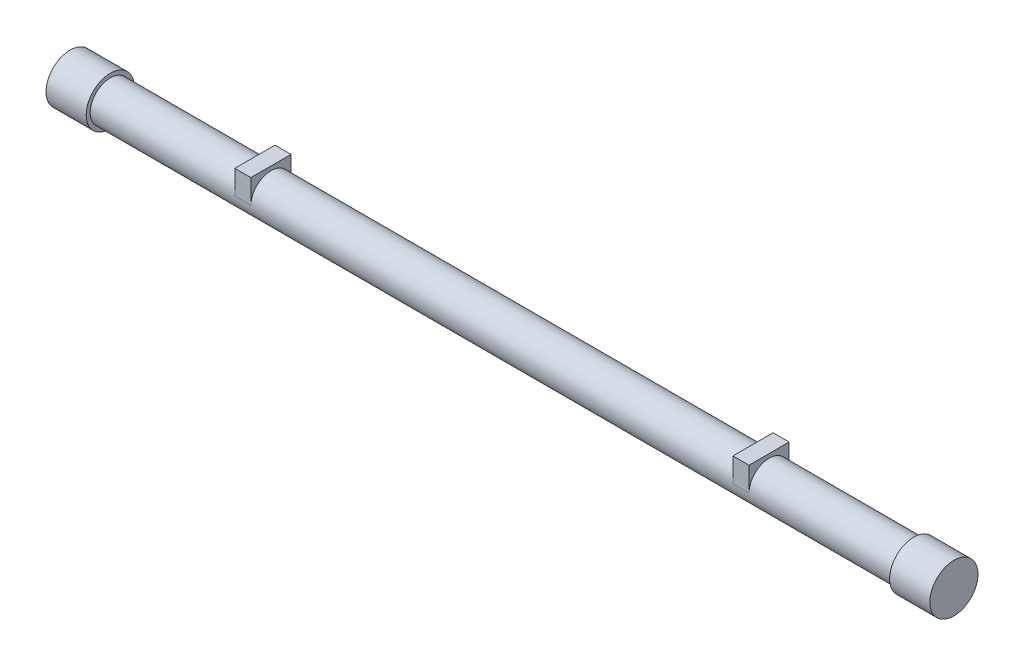
ISO-10303-21;
HEADER;
FILE_DESCRIPTION(('STEP AP214'),'2;1');
FILE_NAME('part.step','',(''),(''),'','','');
FILE_SCHEMA(('AUTOMOTIVE_DESIGN { 1 0 10303 214 1 1 1 1 }'));
ENDSEC;
DATA;
#1=APPLICATION_CONTEXT('core data for automotive mechanical design processes');
#2=APPLICATION_PROTOCOL_DEFINITION('international standard','automotive_design',2000,#1);
#3=PRODUCT_CONTEXT('',#1,'mechanical');
#4=PRODUCT('Part','Part','',(#3));
#5=PRODUCT_RELATED_PRODUCT_CATEGORY('part','',(#4));
#6=PRODUCT_DEFINITION_FORMATION('','',#4);
#7=PRODUCT_DEFINITION_CONTEXT('part definition',#1,'design');
#8=PRODUCT_DEFINITION('design','',#6,#7);
#9=PRODUCT_DEFINITION_SHAPE('','',#8);
#10=(LENGTH_UNIT() NAMED_UNIT(*) SI_UNIT(.MILLI.,.METRE.));
#11=(NAMED_UNIT(*) PLANE_ANGLE_UNIT() SI_UNIT($,.RADIAN.));
#12=(NAMED_UNIT(*) SI_UNIT($,.STERADIAN.) SOLID_ANGLE_UNIT());
#13=UNCERTAINTY_MEASURE_WITH_UNIT(LENGTH_MEASURE(1.E-05),#10,'distance_accuracy_value','');
#14=(GEOMETRIC_REPRESENTATION_CONTEXT(3) GLOBAL_UNCERTAINTY_ASSIGNED_CONTEXT((#13)) GLOBAL_UNIT_ASSIGNED_CONTEXT((#10,
#11,#12)) REPRESENTATION_CONTEXT('',''));
#15=CARTESIAN_POINT('',(0.,0.,0.));
#16=DIRECTION('',(0.,0.,1.));
#17=DIRECTION('',(1.,0.,0.));
#18=AXIS2_PLACEMENT_3D('',#15,#16,#17);
#19=CARTESIAN_POINT('',(550.,0.,0.));
#20=DIRECTION('',(-1.,0.,0.));
#21=DIRECTION('',(0.,0.,1.));
#22=AXIS2_PLACEMENT_3D('',#19,#20,#21);
#23=CYLINDRICAL_SURFACE('',#22,12.5);
#24=CARTESIAN_POINT('',(435.,0.,0.));
#25=DIRECTION('',(-1.,0.,0.));
#26=DIRECTION('',(0.,0.,1.));
#27=AXIS2_PLACEMENT_3D('',#24,#25,#26);
#28=CIRCLE('',#27,12.5);
#29=CARTESIAN_POINT('',(435.,0.,12.5));
#30=VERTEX_POINT('',#29);
#31=CARTESIAN_POINT('',(435.,0.,-12.5));
#32=VERTEX_POINT('',#31);
#33=EDGE_CURVE('E171',#30,#32,#28,.T.);
#34=ORIENTED_EDGE('',*,*,#33,.F.);
#35=DIRECTION('',(1.,0.,0.));
#36=VECTOR('',#35,1.);
#37=CARTESIAN_POINT('',(435.,0.,12.5));
#38=LINE('',#37,#36);
#39=CARTESIAN_POINT('',(425.,0.,12.5));
#40=VERTEX_POINT('',#39);
#41=EDGE_CURVE('E142',#40,#30,#38,.T.);
#42=ORIENTED_EDGE('',*,*,#41,.F.);
#43=CARTESIAN_POINT('',(425.,0.,0.));
#44=DIRECTION('',(1.,0.,0.));
#45=DIRECTION('',(0.,0.,-1.));
#46=AXIS2_PLACEMENT_3D('',#43,#44,#45);
#47=CIRCLE('',#46,12.5);
#48=CARTESIAN_POINT('',(425.,0.,-12.5));
#49=VERTEX_POINT('',#48);
#50=EDGE_CURVE('E169',#49,#40,#47,.T.);
#51=ORIENTED_EDGE('',*,*,#50,.F.);
#52=DIRECTION('',(-1.,0.,0.));
#53=VECTOR('',#52,1.);
#54=CARTESIAN_POINT('',(435.,0.,-12.5));
#55=LINE('',#54,#53);
#56=EDGE_CURVE('E144',#32,#49,#55,.T.);
#57=ORIENTED_EDGE('',*,*,#56,.F.);
#58=EDGE_LOOP('',(#34,#42,#51,#57));
#59=FACE_BOUND('',#58,.T.);
#60=CARTESIAN_POINT('',(525.,0.,0.));
#61=DIRECTION('',(1.,0.,0.));
#62=DIRECTION('',(0.,0.,-1.));
#63=AXIS2_PLACEMENT_3D('',#60,#61,#62);
#64=CIRCLE('',#63,12.5);
#65=CARTESIAN_POINT('',(525.,0.,-12.5));
#66=VERTEX_POINT('',#65);
#67=EDGE_CURVE('E161',#66,#66,#64,.T.);
#68=ORIENTED_EDGE('',*,*,#67,.F.);
#69=EDGE_LOOP('',(#68));
#70=FACE_BOUND('',#69,.T.);
#71=CARTESIAN_POINT('',(25.,0.,0.));
#72=DIRECTION('',(-1.,0.,0.));
#73=DIRECTION('',(0.,0.,1.));
#74=AXIS2_PLACEMENT_3D('',#71,#72,#73);
#75=CIRCLE('',#74,12.5);
#76=CARTESIAN_POINT('',(25.,0.,12.5));
#77=VERTEX_POINT('',#76);
#78=EDGE_CURVE('E166',#77,#77,#75,.T.);
#79=ORIENTED_EDGE('',*,*,#78,.F.);
#80=EDGE_LOOP('',(#79));
#81=FACE_BOUND('',#80,.T.);
#82=CARTESIAN_POINT('',(115.,0.,0.));
#83=DIRECTION('',(1.,0.,0.));
#84=DIRECTION('',(0.,0.,-1.));
#85=AXIS2_PLACEMENT_3D('',#82,#83,#84);
#86=CIRCLE('',#85,12.5);
#87=CARTESIAN_POINT('',(115.,0.,-12.5));
#88=VERTEX_POINT('',#87);
#89=CARTESIAN_POINT('',(115.,0.,12.5));
#90=VERTEX_POINT('',#89);
#91=EDGE_CURVE('E11',#88,#90,#86,.T.);
#92=ORIENTED_EDGE('',*,*,#91,.F.);
#93=DIRECTION('',(-1.,0.,0.));
#94=VECTOR('',#93,1.);
#95=CARTESIAN_POINT('',(115.,0.,-12.5));
#96=LINE('',#95,#94);
#97=CARTESIAN_POINT('',(125.,0.,-12.5));
#98=VERTEX_POINT('',#97);
#99=EDGE_CURVE('E55',#98,#88,#96,.T.);
#100=ORIENTED_EDGE('',*,*,#99,.F.);
#101=CARTESIAN_POINT('',(125.,0.,0.));
#102=DIRECTION('',(-1.,0.,0.));
#103=DIRECTION('',(0.,0.,1.));
#104=AXIS2_PLACEMENT_3D('',#101,#102,#103);
#105=CIRCLE('',#104,12.5);
#106=CARTESIAN_POINT('',(125.,0.,12.5));
#107=VERTEX_POINT('',#106);
#108=EDGE_CURVE('E46',#107,#98,#105,.T.);
#109=ORIENTED_EDGE('',*,*,#108,.F.);
#110=DIRECTION('',(1.,0.,0.));
#111=VECTOR('',#110,1.);
#112=CARTESIAN_POINT('',(115.,0.,12.5));
#113=LINE('',#112,#111);
#114=EDGE_CURVE('E147',#90,#107,#113,.T.);
#115=ORIENTED_EDGE('',*,*,#114,.F.);
#116=EDGE_LOOP('',(#92,#100,#109,#115));
#117=FACE_BOUND('',#116,.T.);
#118=ADVANCED_FACE('F39',(#59,#70,#81,#117),#23,.T.);
#119=CARTESIAN_POINT('',(525.,0.,0.));
#120=DIRECTION('',(1.,0.,0.));
#121=DIRECTION('',(0.,0.,-1.));
#122=AXIS2_PLACEMENT_3D('',#119,#120,#121);
#123=CYLINDRICAL_SURFACE('',#122,15.);
#124=CARTESIAN_POINT('',(525.,0.,0.));
#125=DIRECTION('',(1.,0.,0.));
#126=DIRECTION('',(0.,0.,-1.));
#127=AXIS2_PLACEMENT_3D('',#124,#125,#126);
#128=CIRCLE('',#127,15.);
#129=CARTESIAN_POINT('',(525.,0.,-15.));
#130=VERTEX_POINT('',#129);
#131=EDGE_CURVE('E158',#130,#130,#128,.T.);
#132=ORIENTED_EDGE('',*,*,#131,.T.);
#133=EDGE_LOOP('',(#132));
#134=FACE_BOUND('',#133,.T.);
#135=CARTESIAN_POINT('',(550.,0.,0.));
#136=DIRECTION('',(1.,0.,0.));
#137=DIRECTION('',(0.,0.,-1.));
#138=AXIS2_PLACEMENT_3D('',#135,#136,#137);
#139=CIRCLE('',#138,15.);
#140=CARTESIAN_POINT('',(550.,0.,-15.));
#141=VERTEX_POINT('',#140);
#142=EDGE_CURVE('E156',#141,#141,#139,.T.);
#143=ORIENTED_EDGE('',*,*,#142,.F.);
#144=EDGE_LOOP('',(#143));
#145=FACE_BOUND('',#144,.T.);
#146=ADVANCED_FACE('F186',(#134,#145),#123,.T.);
#147=CARTESIAN_POINT('',(525.,0.,0.));
#148=DIRECTION('',(1.,0.,0.));
#149=DIRECTION('',(0.,0.,-1.));
#150=AXIS2_PLACEMENT_3D('',#147,#148,#149);
#151=PLANE('',#150);
#152=ORIENTED_EDGE('',*,*,#67,.T.);
#153=EDGE_LOOP('',(#152));
#154=FACE_BOUND('',#153,.T.);
#155=ORIENTED_EDGE('',*,*,#131,.F.);
#156=EDGE_LOOP('',(#155));
#157=FACE_BOUND('',#156,.T.);
#158=ADVANCED_FACE('F193',(#154,#157),#151,.F.);
#159=CARTESIAN_POINT('',(550.,0.,0.));
#160=DIRECTION('',(1.,0.,0.));
#161=DIRECTION('',(0.,0.,-1.));
#162=AXIS2_PLACEMENT_3D('',#159,#160,#161);
#163=PLANE('',#162);
#164=ORIENTED_EDGE('',*,*,#142,.T.);
#165=EDGE_LOOP('',(#164));
#166=FACE_BOUND('',#165,.T.);
#167=ADVANCED_FACE('F214',(#166),#163,.T.);
#168=CARTESIAN_POINT('',(25.,0.,0.));
#169=DIRECTION('',(-1.,0.,0.));
#170=DIRECTION('',(0.,0.,1.));
#171=AXIS2_PLACEMENT_3D('',#168,#169,#170);
#172=CYLINDRICAL_SURFACE('',#171,15.);
#173=CARTESIAN_POINT('',(25.,0.,0.));
#174=DIRECTION('',(-1.,0.,0.));
#175=DIRECTION('',(0.,0.,1.));
#176=AXIS2_PLACEMENT_3D('',#173,#174,#175);
#177=CIRCLE('',#176,15.);
#178=CARTESIAN_POINT('',(25.,0.,15.));
#179=VERTEX_POINT('',#178);
#180=EDGE_CURVE('E124',#179,#179,#177,.T.);
#181=ORIENTED_EDGE('',*,*,#180,.T.);
#182=EDGE_LOOP('',(#181));
#183=FACE_BOUND('',#182,.T.);
#184=CARTESIAN_POINT('',(0.,0.,0.));
#185=DIRECTION('',(-1.,0.,0.));
#186=DIRECTION('',(0.,0.,1.));
#187=AXIS2_PLACEMENT_3D('',#184,#185,#186);
#188=CIRCLE('',#187,15.);
#189=CARTESIAN_POINT('',(0.,0.,15.));
#190=VERTEX_POINT('',#189);
#191=EDGE_CURVE('E121',#190,#190,#188,.T.);
#192=ORIENTED_EDGE('',*,*,#191,.F.);
#193=EDGE_LOOP('',(#192));
#194=FACE_BOUND('',#193,.T.);
#195=ADVANCED_FACE('F208',(#183,#194),#172,.T.);
#196=CARTESIAN_POINT('',(25.,0.,0.));
#197=DIRECTION('',(-1.,0.,0.));
#198=DIRECTION('',(0.,0.,1.));
#199=AXIS2_PLACEMENT_3D('',#196,#197,#198);
#200=PLANE('',#199);
#201=ORIENTED_EDGE('',*,*,#78,.T.);
#202=EDGE_LOOP('',(#201));
#203=FACE_BOUND('',#202,.T.);
#204=ORIENTED_EDGE('',*,*,#180,.F.);
#205=EDGE_LOOP('',(#204));
#206=FACE_BOUND('',#205,.T.);
#207=ADVANCED_FACE('F204',(#203,#206),#200,.F.);
#208=CARTESIAN_POINT('',(0.,0.,0.));
#209=DIRECTION('',(1.,0.,0.));
#210=DIRECTION('',(0.,0.,-1.));
#211=AXIS2_PLACEMENT_3D('',#208,#209,#210);
#212=PLANE('',#211);
#213=ORIENTED_EDGE('',*,*,#191,.T.);
#214=EDGE_LOOP('',(#213));
#215=FACE_BOUND('',#214,.T.);
#216=ADVANCED_FACE('F207',(#215),#212,.F.);
#217=CARTESIAN_POINT('',(435.,15.,-12.5));
#218=DIRECTION('',(-1.,0.,0.));
#219=DIRECTION('',(0.,0.,1.));
#220=AXIS2_PLACEMENT_3D('',#217,#218,#219);
#221=PLANE('',#220);
#222=DIRECTION('',(0.,-1.,0.));
#223=VECTOR('',#222,1.);
#224=CARTESIAN_POINT('',(435.,15.,12.5));
#225=LINE('',#224,#223);
#226=CARTESIAN_POINT('',(435.,15.,12.5));
#227=VERTEX_POINT('',#226);
#228=EDGE_CURVE('E138',#227,#30,#225,.T.);
#229=ORIENTED_EDGE('',*,*,#228,.T.);
#230=ORIENTED_EDGE('',*,*,#33,.T.);
#231=DIRECTION('',(0.,-1.,0.));
#232=VECTOR('',#231,1.);
#233=CARTESIAN_POINT('',(435.,15.,-12.5));
#234=LINE('',#233,#232);
#235=CARTESIAN_POINT('',(435.,15.,-12.5));
#236=VERTEX_POINT('',#235);
#237=EDGE_CURVE('E130',#236,#32,#234,.T.);
#238=ORIENTED_EDGE('',*,*,#237,.F.);
#239=DIRECTION('',(0.,0.,-1.));
#240=VECTOR('',#239,1.);
#241=CARTESIAN_POINT('',(435.,15.,-12.5));
#242=LINE('',#241,#240);
#243=EDGE_CURVE('E145',#227,#236,#242,.T.);
#244=ORIENTED_EDGE('',*,*,#243,.F.);
#245=EDGE_LOOP('',(#229,#230,#238,#244));
#246=FACE_BOUND('',#245,.T.);
#247=ADVANCED_FACE('F218',(#246),#221,.F.);
#248=CARTESIAN_POINT('',(435.,15.,-12.5));
#249=DIRECTION('',(0.,0.,1.));
#250=DIRECTION('',(1.,0.,0.));
#251=AXIS2_PLACEMENT_3D('',#248,#249,#250);
#252=PLANE('',#251);
#253=ORIENTED_EDGE('',*,*,#56,.T.);
#254=DIRECTION('',(0.,-1.,0.));
#255=VECTOR('',#254,1.);
#256=CARTESIAN_POINT('',(425.,15.,-12.5));
#257=LINE('',#256,#255);
#258=CARTESIAN_POINT('',(425.,15.,-12.5));
#259=VERTEX_POINT('',#258);
#260=EDGE_CURVE('E132',#259,#49,#257,.T.);
#261=ORIENTED_EDGE('',*,*,#260,.F.);
#262=DIRECTION('',(-1.,0.,0.));
#263=VECTOR('',#262,1.);
#264=CARTESIAN_POINT('',(435.,15.,-12.5));
#265=LINE('',#264,#263);
#266=EDGE_CURVE('E151',#236,#259,#265,.T.);
#267=ORIENTED_EDGE('',*,*,#266,.F.);
#268=ORIENTED_EDGE('',*,*,#237,.T.);
#269=EDGE_LOOP('',(#253,#261,#267,#268));
#270=FACE_BOUND('',#269,.T.);
#271=ADVANCED_FACE('F221',(#270),#252,.F.);
#272=CARTESIAN_POINT('',(425.,15.,-12.5));
#273=DIRECTION('',(1.,0.,0.));
#274=DIRECTION('',(0.,0.,-1.));
#275=AXIS2_PLACEMENT_3D('',#272,#273,#274);
#276=PLANE('',#275);
#277=ORIENTED_EDGE('',*,*,#260,.T.);
#278=ORIENTED_EDGE('',*,*,#50,.T.);
#279=DIRECTION('',(0.,-1.,0.));
#280=VECTOR('',#279,1.);
#281=CARTESIAN_POINT('',(425.,15.,12.5));
#282=LINE('',#281,#280);
#283=CARTESIAN_POINT('',(425.,15.,12.5));
#284=VERTEX_POINT('',#283);
#285=EDGE_CURVE('E135',#284,#40,#282,.T.);
#286=ORIENTED_EDGE('',*,*,#285,.F.);
#287=DIRECTION('',(0.,0.,1.));
#288=VECTOR('',#287,1.);
#289=CARTESIAN_POINT('',(425.,15.,-12.5));
#290=LINE('',#289,#288);
#291=EDGE_CURVE('E149',#259,#284,#290,.T.);
#292=ORIENTED_EDGE('',*,*,#291,.F.);
#293=EDGE_LOOP('',(#277,#278,#286,#292));
#294=FACE_BOUND('',#293,.T.);
#295=ADVANCED_FACE('F238',(#294),#276,.F.);
#296=CARTESIAN_POINT('',(435.,15.,12.5));
#297=DIRECTION('',(0.,0.,-1.));
#298=DIRECTION('',(-1.,0.,0.));
#299=AXIS2_PLACEMENT_3D('',#296,#297,#298);
#300=PLANE('',#299);
#301=ORIENTED_EDGE('',*,*,#41,.T.);
#302=ORIENTED_EDGE('',*,*,#228,.F.);
#303=DIRECTION('',(1.,0.,0.));
#304=VECTOR('',#303,1.);
#305=CARTESIAN_POINT('',(435.,15.,12.5));
#306=LINE('',#305,#304);
#307=EDGE_CURVE('E141',#284,#227,#306,.T.);
#308=ORIENTED_EDGE('',*,*,#307,.F.);
#309=ORIENTED_EDGE('',*,*,#285,.T.);
#310=EDGE_LOOP('',(#301,#302,#308,#309));
#311=FACE_BOUND('',#310,.T.);
#312=ADVANCED_FACE('F234',(#311),#300,.F.);
#313=CARTESIAN_POINT('',(0.,15.,0.));
#314=DIRECTION('',(0.,-1.,0.));
#315=DIRECTION('',(0.,0.,-1.));
#316=AXIS2_PLACEMENT_3D('',#313,#314,#315);
#317=PLANE('',#316);
#318=ORIENTED_EDGE('',*,*,#243,.T.);
#319=ORIENTED_EDGE('',*,*,#266,.T.);
#320=ORIENTED_EDGE('',*,*,#291,.T.);
#321=ORIENTED_EDGE('',*,*,#307,.T.);
#322=EDGE_LOOP('',(#318,#319,#320,#321));
#323=FACE_BOUND('',#322,.T.);
#324=ADVANCED_FACE('F231',(#323),#317,.F.);
#325=CARTESIAN_POINT('',(115.,15.,-12.5));
#326=DIRECTION('',(1.,0.,0.));
#327=DIRECTION('',(0.,0.,-1.));
#328=AXIS2_PLACEMENT_3D('',#325,#326,#327);
#329=PLANE('',#328);
#330=DIRECTION('',(0.,-1.,0.));
#331=VECTOR('',#330,1.);
#332=CARTESIAN_POINT('',(115.,15.,-12.5));
#333=LINE('',#332,#331);
#334=CARTESIAN_POINT('',(115.,15.,-12.5));
#335=VERTEX_POINT('',#334);
#336=EDGE_CURVE('E179',#335,#88,#333,.T.);
#337=ORIENTED_EDGE('',*,*,#336,.T.);
#338=ORIENTED_EDGE('',*,*,#91,.T.);
#339=DIRECTION('',(0.,-1.,0.));
#340=VECTOR('',#339,1.);
#341=CARTESIAN_POINT('',(115.,15.,12.5));
#342=LINE('',#341,#340);
#343=CARTESIAN_POINT('',(115.,15.,12.5));
#344=VERTEX_POINT('',#343);
#345=EDGE_CURVE('E104',#344,#90,#342,.T.);
#346=ORIENTED_EDGE('',*,*,#345,.F.);
#347=DIRECTION('',(0.,0.,1.));
#348=VECTOR('',#347,1.);
#349=CARTESIAN_POINT('',(115.,15.,-12.5));
#350=LINE('',#349,#348);
#351=EDGE_CURVE('E110',#335,#344,#350,.T.);
#352=ORIENTED_EDGE('',*,*,#351,.F.);
#353=EDGE_LOOP('',(#337,#338,#346,#352));
#354=FACE_BOUND('',#353,.T.);
#355=ADVANCED_FACE('F120',(#354),#329,.F.);
#356=CARTESIAN_POINT('',(115.,15.,12.5));
#357=DIRECTION('',(0.,0.,-1.));
#358=DIRECTION('',(-1.,0.,0.));
#359=AXIS2_PLACEMENT_3D('',#356,#357,#358);
#360=PLANE('',#359);
#361=ORIENTED_EDGE('',*,*,#114,.T.);
#362=DIRECTION('',(0.,-1.,0.));
#363=VECTOR('',#362,1.);
#364=CARTESIAN_POINT('',(125.,15.,12.5));
#365=LINE('',#364,#363);
#366=CARTESIAN_POINT('',(125.,15.,12.5));
#367=VERTEX_POINT('',#366);
#368=EDGE_CURVE('E106',#367,#107,#365,.T.);
#369=ORIENTED_EDGE('',*,*,#368,.F.);
#370=DIRECTION('',(1.,0.,0.));
#371=VECTOR('',#370,1.);
#372=CARTESIAN_POINT('',(115.,15.,12.5));
#373=LINE('',#372,#371);
#374=EDGE_CURVE('E99',#344,#367,#373,.T.);
#375=ORIENTED_EDGE('',*,*,#374,.F.);
#376=ORIENTED_EDGE('',*,*,#345,.T.);
#377=EDGE_LOOP('',(#361,#369,#375,#376));
#378=FACE_BOUND('',#377,.T.);
#379=ADVANCED_FACE('F102',(#378),#360,.F.);
#380=CARTESIAN_POINT('',(125.,15.,-12.5));
#381=DIRECTION('',(-1.,0.,0.));
#382=DIRECTION('',(0.,0.,1.));
#383=AXIS2_PLACEMENT_3D('',#380,#381,#382);
#384=PLANE('',#383);
#385=ORIENTED_EDGE('',*,*,#368,.T.);
#386=ORIENTED_EDGE('',*,*,#108,.T.);
#387=DIRECTION('',(0.,-1.,0.));
#388=VECTOR('',#387,1.);
#389=CARTESIAN_POINT('',(125.,15.,-12.5));
#390=LINE('',#389,#388);
#391=CARTESIAN_POINT('',(125.,15.,-12.5));
#392=VERTEX_POINT('',#391);
#393=EDGE_CURVE('E126',#392,#98,#390,.T.);
#394=ORIENTED_EDGE('',*,*,#393,.F.);
#395=DIRECTION('',(0.,0.,-1.));
#396=VECTOR('',#395,1.);
#397=CARTESIAN_POINT('',(125.,15.,-12.5));
#398=LINE('',#397,#396);
#399=EDGE_CURVE('E109',#367,#392,#398,.T.);
#400=ORIENTED_EDGE('',*,*,#399,.F.);
#401=EDGE_LOOP('',(#385,#386,#394,#400));
#402=FACE_BOUND('',#401,.T.);
#403=ADVANCED_FACE('F176',(#402),#384,.F.);
#404=CARTESIAN_POINT('',(115.,15.,-12.5));
#405=DIRECTION('',(0.,0.,1.));
#406=DIRECTION('',(1.,0.,0.));
#407=AXIS2_PLACEMENT_3D('',#404,#405,#406);
#408=PLANE('',#407);
#409=ORIENTED_EDGE('',*,*,#99,.T.);
#410=ORIENTED_EDGE('',*,*,#336,.F.);
#411=DIRECTION('',(-1.,0.,0.));
#412=VECTOR('',#411,1.);
#413=CARTESIAN_POINT('',(115.,15.,-12.5));
#414=LINE('',#413,#412);
#415=EDGE_CURVE('E115',#392,#335,#414,.T.);
#416=ORIENTED_EDGE('',*,*,#415,.F.);
#417=ORIENTED_EDGE('',*,*,#393,.T.);
#418=EDGE_LOOP('',(#409,#410,#416,#417));
#419=FACE_BOUND('',#418,.T.);
#420=ADVANCED_FACE('F178',(#419),#408,.F.);
#421=CARTESIAN_POINT('',(0.,15.,0.));
#422=DIRECTION('',(0.,1.,0.));
#423=DIRECTION('',(0.,0.,1.));
#424=AXIS2_PLACEMENT_3D('',#421,#422,#423);
#425=PLANE('',#424);
#426=ORIENTED_EDGE('',*,*,#351,.T.);
#427=ORIENTED_EDGE('',*,*,#374,.T.);
#428=ORIENTED_EDGE('',*,*,#399,.T.);
#429=ORIENTED_EDGE('',*,*,#415,.T.);
#430=EDGE_LOOP('',(#426,#427,#428,#429));
#431=FACE_BOUND('',#430,.T.);
#432=ADVANCED_FACE('F113',(#431),#425,.T.);
#433=CLOSED_SHELL('',(#118,#146,#158,#167,#195,#207,#216,#247,#271,#295,#312,#324,#355,#379,
#403,#420,#432));
#434=MANIFOLD_SOLID_BREP('B2',#433);
#435=ADVANCED_BREP_SHAPE_REPRESENTATION('',(#18,#434),#14);
#436=SHAPE_DEFINITION_REPRESENTATION(#9,#435);
ENDSEC;
END-ISO-10303-21;
